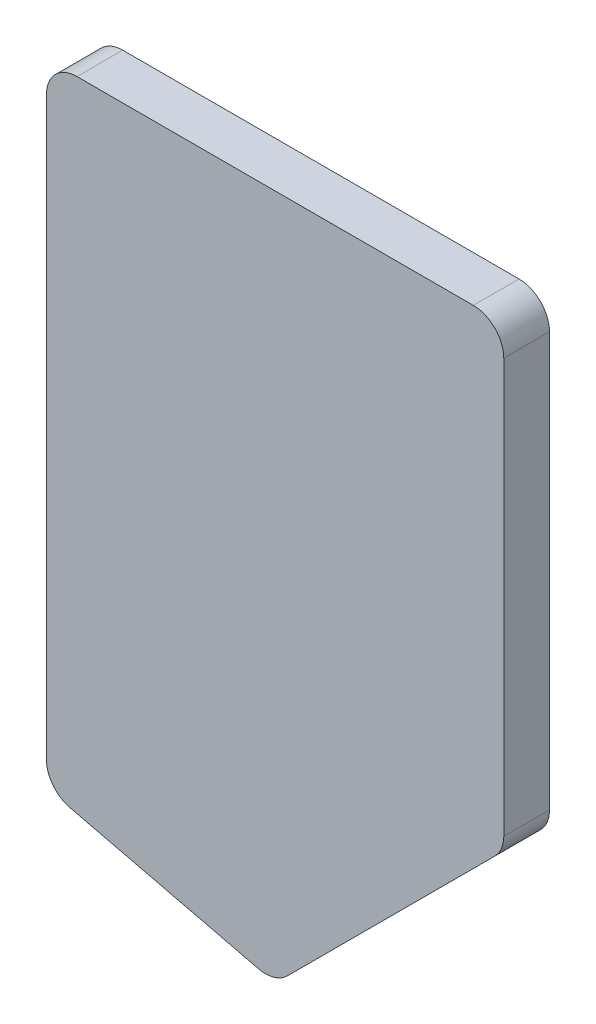
ISO-10303-21;
HEADER;
FILE_DESCRIPTION(('STEP AP214'),'2;1');
FILE_NAME('part.step','',(''),(''),'','','');
FILE_SCHEMA(('AUTOMOTIVE_DESIGN { 1 0 10303 214 1 1 1 1 }'));
ENDSEC;
DATA;
#1=APPLICATION_CONTEXT('core data for automotive mechanical design processes');
#2=APPLICATION_PROTOCOL_DEFINITION('international standard','automotive_design',2000,#1);
#3=PRODUCT_CONTEXT('',#1,'mechanical');
#4=PRODUCT('Part','Part','',(#3));
#5=PRODUCT_RELATED_PRODUCT_CATEGORY('part','',(#4));
#6=PRODUCT_DEFINITION_FORMATION('','',#4);
#7=PRODUCT_DEFINITION_CONTEXT('part definition',#1,'design');
#8=PRODUCT_DEFINITION('design','',#6,#7);
#9=PRODUCT_DEFINITION_SHAPE('','',#8);
#10=(LENGTH_UNIT() NAMED_UNIT(*) SI_UNIT(.MILLI.,.METRE.));
#11=(NAMED_UNIT(*) PLANE_ANGLE_UNIT() SI_UNIT($,.RADIAN.));
#12=(NAMED_UNIT(*) SI_UNIT($,.STERADIAN.) SOLID_ANGLE_UNIT());
#13=UNCERTAINTY_MEASURE_WITH_UNIT(LENGTH_MEASURE(1.E-05),#10,'distance_accuracy_value','');
#14=(GEOMETRIC_REPRESENTATION_CONTEXT(3) GLOBAL_UNCERTAINTY_ASSIGNED_CONTEXT((#13)) GLOBAL_UNIT_ASSIGNED_CONTEXT((#10,
#11,#12)) REPRESENTATION_CONTEXT('',''));
#15=CARTESIAN_POINT('',(0.,0.,0.));
#16=DIRECTION('',(0.,0.,1.));
#17=DIRECTION('',(1.,0.,0.));
#18=AXIS2_PLACEMENT_3D('',#15,#16,#17);
#19=CARTESIAN_POINT('',(140.,-42.3578643762691,15.));
#20=DIRECTION('',(0.,0.,1.));
#21=DIRECTION('',(1.,0.,0.));
#22=AXIS2_PLACEMENT_3D('',#19,#20,#21);
#23=CYLINDRICAL_SURFACE('',#22,10.);
#24=DIRECTION('',(0.,0.,1.));
#25=VECTOR('',#24,1.);
#26=CARTESIAN_POINT('',(147.071067811866,-49.4289321881345,15.));
#27=LINE('',#26,#25);
#28=CARTESIAN_POINT('',(147.071067811866,-49.4289321881345,0.));
#29=VERTEX_POINT('',#28);
#30=CARTESIAN_POINT('',(147.071067811866,-49.4289321881345,15.));
#31=VERTEX_POINT('',#30);
#32=EDGE_CURVE('E330',#29,#31,#27,.T.);
#33=ORIENTED_EDGE('',*,*,#32,.F.);
#34=CARTESIAN_POINT('',(140.,-42.3578643762691,0.));
#35=DIRECTION('',(0.,0.,1.));
#36=DIRECTION('',(1.,0.,0.));
#37=AXIS2_PLACEMENT_3D('',#34,#35,#36);
#38=CIRCLE('',#37,10.);
#39=CARTESIAN_POINT('',(150.,-42.3578643762691,0.));
#40=VERTEX_POINT('',#39);
#41=EDGE_CURVE('E336',#40,#29,#38,.F.);
#42=ORIENTED_EDGE('',*,*,#41,.F.);
#43=DIRECTION('',(0.,0.,1.));
#44=VECTOR('',#43,1.);
#45=CARTESIAN_POINT('',(150.,-42.3578643762691,15.));
#46=LINE('',#45,#44);
#47=CARTESIAN_POINT('',(150.,-42.3578643762691,15.));
#48=VERTEX_POINT('',#47);
#49=EDGE_CURVE('E333',#48,#40,#46,.F.);
#50=ORIENTED_EDGE('',*,*,#49,.F.);
#51=CARTESIAN_POINT('',(140.,-42.3578643762691,15.));
#52=DIRECTION('',(0.,0.,1.));
#53=DIRECTION('',(1.,0.,0.));
#54=AXIS2_PLACEMENT_3D('',#51,#52,#53);
#55=CIRCLE('',#54,10.);
#56=EDGE_CURVE('E338',#31,#48,#55,.T.);
#57=ORIENTED_EDGE('',*,*,#56,.F.);
#58=EDGE_LOOP('',(#33,#42,#50,#57));
#59=FACE_BOUND('',#58,.T.);
#60=ADVANCED_FACE('F32',(#59),#23,.T.);
#61=CARTESIAN_POINT('',(71.8885745822702,-110.469289794,15.));
#62=DIRECTION('',(0.,0.,1.));
#63=DIRECTION('',(1.,0.,0.));
#64=AXIS2_PLACEMENT_3D('',#61,#62,#63);
#65=CYLINDRICAL_SURFACE('',#64,10.);
#66=DIRECTION('',(0.,0.,1.));
#67=VECTOR('',#66,1.);
#68=CARTESIAN_POINT('',(69.5548450575168,-120.193162813805,15.));
#69=LINE('',#68,#67);
#70=CARTESIAN_POINT('',(69.5548450575168,-120.193162813805,0.));
#71=VERTEX_POINT('',#70);
#72=CARTESIAN_POINT('',(69.5548450575168,-120.193162813805,15.));
#73=VERTEX_POINT('',#72);
#74=EDGE_CURVE('E320',#71,#73,#69,.T.);
#75=ORIENTED_EDGE('',*,*,#74,.F.);
#76=CARTESIAN_POINT('',(71.8885745822702,-110.469289794,0.));
#77=DIRECTION('',(0.,0.,1.));
#78=DIRECTION('',(1.,0.,0.));
#79=AXIS2_PLACEMENT_3D('',#76,#77,#78);
#80=CIRCLE('',#79,10.);
#81=CARTESIAN_POINT('',(78.9596423941357,-117.540357605865,0.));
#82=VERTEX_POINT('',#81);
#83=EDGE_CURVE('E326',#82,#71,#80,.F.);
#84=ORIENTED_EDGE('',*,*,#83,.F.);
#85=DIRECTION('',(0.,0.,1.));
#86=VECTOR('',#85,1.);
#87=CARTESIAN_POINT('',(78.9596423941357,-117.540357605865,15.));
#88=LINE('',#87,#86);
#89=CARTESIAN_POINT('',(78.9596423941357,-117.540357605865,15.));
#90=VERTEX_POINT('',#89);
#91=EDGE_CURVE('E323',#90,#82,#88,.F.);
#92=ORIENTED_EDGE('',*,*,#91,.F.);
#93=CARTESIAN_POINT('',(71.8885745822702,-110.469289794,15.));
#94=DIRECTION('',(0.,0.,1.));
#95=DIRECTION('',(1.,0.,0.));
#96=AXIS2_PLACEMENT_3D('',#93,#94,#95);
#97=CIRCLE('',#96,10.);
#98=EDGE_CURVE('E328',#73,#90,#97,.T.);
#99=ORIENTED_EDGE('',*,*,#98,.F.);
#100=EDGE_LOOP('',(#75,#84,#92,#99));
#101=FACE_BOUND('',#100,.T.);
#102=ADVANCED_FACE('F383',(#101),#65,.T.);
#103=CARTESIAN_POINT('',(10.,-95.6160318942542,15.));
#104=DIRECTION('',(0.,0.,1.));
#105=DIRECTION('',(1.,0.,0.));
#106=AXIS2_PLACEMENT_3D('',#103,#104,#105);
#107=CYLINDRICAL_SURFACE('',#106,10.);
#108=DIRECTION('',(0.,0.,1.));
#109=VECTOR('',#108,1.);
#110=CARTESIAN_POINT('',(0.,-95.6160318942542,15.));
#111=LINE('',#110,#109);
#112=CARTESIAN_POINT('',(0.,-95.6160318942541,0.));
#113=VERTEX_POINT('',#112);
#114=CARTESIAN_POINT('',(0.,-95.6160318942541,15.));
#115=VERTEX_POINT('',#114);
#116=EDGE_CURVE('E297',#113,#115,#111,.T.);
#117=ORIENTED_EDGE('',*,*,#116,.F.);
#118=CARTESIAN_POINT('',(10.,-95.6160318942542,0.));
#119=DIRECTION('',(0.,0.,1.));
#120=DIRECTION('',(1.,0.,0.));
#121=AXIS2_PLACEMENT_3D('',#118,#119,#120);
#122=CIRCLE('',#121,10.);
#123=CARTESIAN_POINT('',(7.66627047524661,-105.339904914059,0.));
#124=VERTEX_POINT('',#123);
#125=EDGE_CURVE('E315',#124,#113,#122,.F.);
#126=ORIENTED_EDGE('',*,*,#125,.F.);
#127=DIRECTION('',(0.,0.,1.));
#128=VECTOR('',#127,1.);
#129=CARTESIAN_POINT('',(7.66627047524659,-105.339904914059,15.));
#130=LINE('',#129,#128);
#131=CARTESIAN_POINT('',(7.66627047524661,-105.339904914059,15.));
#132=VERTEX_POINT('',#131);
#133=EDGE_CURVE('E312',#132,#124,#130,.F.);
#134=ORIENTED_EDGE('',*,*,#133,.F.);
#135=CARTESIAN_POINT('',(10.,-95.6160318942542,15.));
#136=DIRECTION('',(0.,0.,1.));
#137=DIRECTION('',(1.,0.,0.));
#138=AXIS2_PLACEMENT_3D('',#135,#136,#137);
#139=CIRCLE('',#138,10.);
#140=EDGE_CURVE('E318',#115,#132,#139,.T.);
#141=ORIENTED_EDGE('',*,*,#140,.F.);
#142=EDGE_LOOP('',(#117,#126,#134,#141));
#143=FACE_BOUND('',#142,.T.);
#144=ADVANCED_FACE('F376',(#143),#107,.T.);
#145=CARTESIAN_POINT('',(75.,-121.500000000001,15.));
#146=DIRECTION('',(0.23337295247534,0.972387301980514,0.));
#147=DIRECTION('',(-0.972387301980514,0.23337295247534,0.));
#148=AXIS2_PLACEMENT_3D('',#145,#146,#147);
#149=PLANE('',#148);
#150=DIRECTION('',(0.972387301980514,-0.23337295247534,0.));
#151=VECTOR('',#150,1.);
#152=CARTESIAN_POINT('',(75.,-121.500000000001,0.));
#153=LINE('',#152,#151);
#154=EDGE_CURVE('E260',#124,#71,#153,.T.);
#155=ORIENTED_EDGE('',*,*,#154,.T.);
#156=ORIENTED_EDGE('',*,*,#74,.T.);
#157=DIRECTION('',(0.972387301980514,-0.23337295247534,0.));
#158=VECTOR('',#157,1.);
#159=CARTESIAN_POINT('',(75.,-121.500000000001,15.));
#160=LINE('',#159,#158);
#161=EDGE_CURVE('E282',#132,#73,#160,.T.);
#162=ORIENTED_EDGE('',*,*,#161,.F.);
#163=ORIENTED_EDGE('',*,*,#133,.T.);
#164=EDGE_LOOP('',(#155,#156,#162,#163));
#165=FACE_BOUND('',#164,.T.);
#166=ADVANCED_FACE('F380',(#165),#149,.F.);
#167=CARTESIAN_POINT('',(150.,-46.5,15.));
#168=DIRECTION('',(-0.707106781186554,0.707106781186541,0.));
#169=DIRECTION('',(-0.707106781186541,-0.707106781186554,0.));
#170=AXIS2_PLACEMENT_3D('',#167,#168,#169);
#171=PLANE('',#170);
#172=DIRECTION('',(0.707106781186541,0.707106781186554,0.));
#173=VECTOR('',#172,1.);
#174=CARTESIAN_POINT('',(150.,-46.5,0.));
#175=LINE('',#174,#173);
#176=EDGE_CURVE('E300',#82,#29,#175,.T.);
#177=ORIENTED_EDGE('',*,*,#176,.T.);
#178=ORIENTED_EDGE('',*,*,#32,.T.);
#179=DIRECTION('',(0.707106781186541,0.707106781186554,0.));
#180=VECTOR('',#179,1.);
#181=CARTESIAN_POINT('',(150.,-46.5,15.));
#182=LINE('',#181,#180);
#183=EDGE_CURVE('E285',#90,#31,#182,.T.);
#184=ORIENTED_EDGE('',*,*,#183,.F.);
#185=ORIENTED_EDGE('',*,*,#91,.T.);
#186=EDGE_LOOP('',(#177,#178,#184,#185));
#187=FACE_BOUND('',#186,.T.);
#188=ADVANCED_FACE('F387',(#187),#171,.F.);
#189=CARTESIAN_POINT('',(150.,103.5,15.));
#190=DIRECTION('',(-1.,0.,0.));
#191=DIRECTION('',(0.,0.,1.));
#192=AXIS2_PLACEMENT_3D('',#189,#190,#191);
#193=PLANE('',#192);
#194=DIRECTION('',(0.,1.,0.));
#195=VECTOR('',#194,1.);
#196=CARTESIAN_POINT('',(150.,103.5,0.));
#197=LINE('',#196,#195);
#198=CARTESIAN_POINT('',(150.,93.5,0.));
#199=VERTEX_POINT('',#198);
#200=EDGE_CURVE('E303',#40,#199,#197,.T.);
#201=ORIENTED_EDGE('',*,*,#200,.T.);
#202=DIRECTION('',(0.,0.,-1.));
#203=VECTOR('',#202,1.);
#204=CARTESIAN_POINT('',(150.,93.5,15.));
#205=LINE('',#204,#203);
#206=CARTESIAN_POINT('',(150.,93.5,15.));
#207=VERTEX_POINT('',#206);
#208=EDGE_CURVE('E345',#199,#207,#205,.F.);
#209=ORIENTED_EDGE('',*,*,#208,.T.);
#210=DIRECTION('',(0.,1.,0.));
#211=VECTOR('',#210,1.);
#212=CARTESIAN_POINT('',(150.,103.5,15.));
#213=LINE('',#212,#211);
#214=EDGE_CURVE('E289',#48,#207,#213,.T.);
#215=ORIENTED_EDGE('',*,*,#214,.F.);
#216=ORIENTED_EDGE('',*,*,#49,.T.);
#217=EDGE_LOOP('',(#201,#209,#215,#216));
#218=FACE_BOUND('',#217,.T.);
#219=ADVANCED_FACE('F394',(#218),#193,.F.);
#220=CARTESIAN_POINT('',(0.,103.5,15.));
#221=DIRECTION('',(0.,-1.,0.));
#222=DIRECTION('',(0.,0.,-1.));
#223=AXIS2_PLACEMENT_3D('',#220,#221,#222);
#224=PLANE('',#223);
#225=DIRECTION('',(-1.,0.,0.));
#226=VECTOR('',#225,1.);
#227=CARTESIAN_POINT('',(0.,103.5,0.));
#228=LINE('',#227,#226);
#229=CARTESIAN_POINT('',(140.,103.5,0.));
#230=VERTEX_POINT('',#229);
#231=CARTESIAN_POINT('',(10.,103.5,0.));
#232=VERTEX_POINT('',#231);
#233=EDGE_CURVE('E306',#230,#232,#228,.T.);
#234=ORIENTED_EDGE('',*,*,#233,.T.);
#235=DIRECTION('',(0.,0.,-1.));
#236=VECTOR('',#235,1.);
#237=CARTESIAN_POINT('',(10.,103.5,15.));
#238=LINE('',#237,#236);
#239=CARTESIAN_POINT('',(10.,103.5,15.));
#240=VERTEX_POINT('',#239);
#241=EDGE_CURVE('E40',#232,#240,#238,.F.);
#242=ORIENTED_EDGE('',*,*,#241,.T.);
#243=DIRECTION('',(-1.,0.,0.));
#244=VECTOR('',#243,1.);
#245=CARTESIAN_POINT('',(0.,103.5,15.));
#246=LINE('',#245,#244);
#247=CARTESIAN_POINT('',(140.,103.5,15.));
#248=VERTEX_POINT('',#247);
#249=EDGE_CURVE('E292',#248,#240,#246,.T.);
#250=ORIENTED_EDGE('',*,*,#249,.F.);
#251=DIRECTION('',(0.,0.,-1.));
#252=VECTOR('',#251,1.);
#253=CARTESIAN_POINT('',(140.,103.5,15.));
#254=LINE('',#253,#252);
#255=EDGE_CURVE('E340',#248,#230,#254,.T.);
#256=ORIENTED_EDGE('',*,*,#255,.T.);
#257=EDGE_LOOP('',(#234,#242,#250,#256));
#258=FACE_BOUND('',#257,.T.);
#259=ADVANCED_FACE('F356',(#258),#224,.F.);
#260=CARTESIAN_POINT('',(0.,103.5,15.));
#261=DIRECTION('',(1.,0.,0.));
#262=DIRECTION('',(0.,0.,-1.));
#263=AXIS2_PLACEMENT_3D('',#260,#261,#262);
#264=PLANE('',#263);
#265=DIRECTION('',(0.,-1.,0.));
#266=VECTOR('',#265,1.);
#267=CARTESIAN_POINT('',(0.,103.5,15.));
#268=LINE('',#267,#266);
#269=CARTESIAN_POINT('',(0.,93.5,15.));
#270=VERTEX_POINT('',#269);
#271=EDGE_CURVE('E295',#270,#115,#268,.T.);
#272=ORIENTED_EDGE('',*,*,#271,.F.);
#273=DIRECTION('',(0.,0.,-1.));
#274=VECTOR('',#273,1.);
#275=CARTESIAN_POINT('',(0.,93.5,15.));
#276=LINE('',#275,#274);
#277=CARTESIAN_POINT('',(0.,93.5,0.));
#278=VERTEX_POINT('',#277);
#279=EDGE_CURVE('E349',#270,#278,#276,.T.);
#280=ORIENTED_EDGE('',*,*,#279,.T.);
#281=DIRECTION('',(0.,-1.,0.));
#282=VECTOR('',#281,1.);
#283=CARTESIAN_POINT('',(0.,103.5,0.));
#284=LINE('',#283,#282);
#285=EDGE_CURVE('E286',#278,#113,#284,.T.);
#286=ORIENTED_EDGE('',*,*,#285,.T.);
#287=ORIENTED_EDGE('',*,*,#116,.T.);
#288=EDGE_LOOP('',(#272,#280,#286,#287));
#289=FACE_BOUND('',#288,.T.);
#290=ADVANCED_FACE('F368',(#289),#264,.F.);
#291=CARTESIAN_POINT('',(0.,0.,15.));
#292=DIRECTION('',(0.,0.,1.));
#293=DIRECTION('',(1.,0.,0.));
#294=AXIS2_PLACEMENT_3D('',#291,#292,#293);
#295=PLANE('',#294);
#296=ORIENTED_EDGE('',*,*,#249,.T.);
#297=CARTESIAN_POINT('',(10.,93.5,15.));
#298=DIRECTION('',(0.,0.,1.));
#299=DIRECTION('',(1.,0.,0.));
#300=AXIS2_PLACEMENT_3D('',#297,#298,#299);
#301=CIRCLE('',#300,10.);
#302=EDGE_CURVE('E11',#240,#270,#301,.T.);
#303=ORIENTED_EDGE('',*,*,#302,.T.);
#304=ORIENTED_EDGE('',*,*,#271,.T.);
#305=ORIENTED_EDGE('',*,*,#140,.T.);
#306=ORIENTED_EDGE('',*,*,#161,.T.);
#307=ORIENTED_EDGE('',*,*,#98,.T.);
#308=ORIENTED_EDGE('',*,*,#183,.T.);
#309=ORIENTED_EDGE('',*,*,#56,.T.);
#310=ORIENTED_EDGE('',*,*,#214,.T.);
#311=CARTESIAN_POINT('',(140.,93.5,15.));
#312=DIRECTION('',(0.,0.,1.));
#313=DIRECTION('',(1.,0.,0.));
#314=AXIS2_PLACEMENT_3D('',#311,#312,#313);
#315=CIRCLE('',#314,10.);
#316=EDGE_CURVE('E347',#207,#248,#315,.T.);
#317=ORIENTED_EDGE('',*,*,#316,.T.);
#318=EDGE_LOOP('',(#296,#303,#304,#305,#306,#307,#308,#309,#310,#317));
#319=FACE_BOUND('',#318,.T.);
#320=ADVANCED_FACE('F362',(#319),#295,.T.);
#321=CARTESIAN_POINT('',(0.,0.,0.));
#322=DIRECTION('',(0.,0.,1.));
#323=DIRECTION('',(1.,0.,0.));
#324=AXIS2_PLACEMENT_3D('',#321,#322,#323);
#325=PLANE('',#324);
#326=DIRECTION('',(0.,1.,0.));
#327=VECTOR('',#326,1.);
#328=CARTESIAN_POINT('',(12.2354893582894,0.,0.));
#329=LINE('',#328,#327);
#330=CARTESIAN_POINT('',(12.2354893582894,0.,0.));
#331=VERTEX_POINT('',#330);
#332=CARTESIAN_POINT('',(12.2354893582894,3.56242925771255,0.));
#333=VERTEX_POINT('',#332);
#334=EDGE_CURVE('E250',#331,#333,#329,.T.);
#335=ORIENTED_EDGE('',*,*,#334,.F.);
#336=DIRECTION('',(-1.,0.,0.));
#337=VECTOR('',#336,1.);
#338=CARTESIAN_POINT('',(0.,0.,0.));
#339=LINE('',#338,#337);
#340=CARTESIAN_POINT('',(87.7831553618904,0.,0.));
#341=VERTEX_POINT('',#340);
#342=EDGE_CURVE('E248',#341,#331,#339,.T.);
#343=ORIENTED_EDGE('',*,*,#342,.F.);
#344=DIRECTION('',(0.,1.,0.));
#345=VECTOR('',#344,1.);
#346=CARTESIAN_POINT('',(87.7831553618904,0.,0.));
#347=LINE('',#346,#345);
#348=CARTESIAN_POINT('',(87.7831553618904,94.4213382511947,0.));
#349=VERTEX_POINT('',#348);
#350=EDGE_CURVE('E203',#341,#349,#347,.T.);
#351=ORIENTED_EDGE('',*,*,#350,.T.);
#352=DIRECTION('',(-1.,0.,0.));
#353=VECTOR('',#352,1.);
#354=CARTESIAN_POINT('',(0.,94.4213382511947,0.));
#355=LINE('',#354,#353);
#356=CARTESIAN_POINT('',(83.5815560775899,94.4213382511947,0.));
#357=VERTEX_POINT('',#356);
#358=EDGE_CURVE('E206',#349,#357,#355,.T.);
#359=ORIENTED_EDGE('',*,*,#358,.T.);
#360=DIRECTION('',(0.617590976132357,0.786499450857966,0.));
#361=VECTOR('',#360,1.);
#362=CARTESIAN_POINT('',(5.83824952232281,-4.5844281486304,0.));
#363=LINE('',#362,#361);
#364=EDGE_CURVE('E253',#333,#357,#363,.T.);
#365=ORIENTED_EDGE('',*,*,#364,.F.);
#366=EDGE_LOOP('',(#335,#343,#351,#359,#365));
#367=FACE_BOUND('',#366,.T.);
#368=ORIENTED_EDGE('',*,*,#285,.F.);
#369=CARTESIAN_POINT('',(10.,93.5,0.));
#370=DIRECTION('',(0.,0.,1.));
#371=DIRECTION('',(1.,0.,0.));
#372=AXIS2_PLACEMENT_3D('',#369,#370,#371);
#373=CIRCLE('',#372,10.);
#374=EDGE_CURVE('E352',#278,#232,#373,.F.);
#375=ORIENTED_EDGE('',*,*,#374,.T.);
#376=ORIENTED_EDGE('',*,*,#233,.F.);
#377=CARTESIAN_POINT('',(140.,93.5,0.));
#378=DIRECTION('',(0.,0.,1.));
#379=DIRECTION('',(1.,0.,0.));
#380=AXIS2_PLACEMENT_3D('',#377,#378,#379);
#381=CIRCLE('',#380,10.);
#382=EDGE_CURVE('E343',#230,#199,#381,.F.);
#383=ORIENTED_EDGE('',*,*,#382,.T.);
#384=ORIENTED_EDGE('',*,*,#200,.F.);
#385=ORIENTED_EDGE('',*,*,#41,.T.);
#386=ORIENTED_EDGE('',*,*,#176,.F.);
#387=ORIENTED_EDGE('',*,*,#83,.T.);
#388=ORIENTED_EDGE('',*,*,#154,.F.);
#389=ORIENTED_EDGE('',*,*,#125,.T.);
#390=EDGE_LOOP('',(#368,#375,#376,#383,#384,#385,#386,#387,#388,#389));
#391=FACE_BOUND('',#390,.T.);
#392=ADVANCED_FACE('F370',(#367,#391),#325,.F.);
#393=CARTESIAN_POINT('',(140.,93.5,15.));
#394=DIRECTION('',(0.,0.,-1.));
#395=DIRECTION('',(-1.,0.,0.));
#396=AXIS2_PLACEMENT_3D('',#393,#394,#395);
#397=CYLINDRICAL_SURFACE('',#396,10.);
#398=ORIENTED_EDGE('',*,*,#316,.F.);
#399=ORIENTED_EDGE('',*,*,#208,.F.);
#400=ORIENTED_EDGE('',*,*,#382,.F.);
#401=ORIENTED_EDGE('',*,*,#255,.F.);
#402=EDGE_LOOP('',(#398,#399,#400,#401));
#403=FACE_BOUND('',#402,.T.);
#404=ADVANCED_FACE('F397',(#403),#397,.T.);
#405=CARTESIAN_POINT('',(10.,93.5,15.));
#406=DIRECTION('',(0.,0.,-1.));
#407=DIRECTION('',(-1.,0.,0.));
#408=AXIS2_PLACEMENT_3D('',#405,#406,#407);
#409=CYLINDRICAL_SURFACE('',#408,10.);
#410=ORIENTED_EDGE('',*,*,#302,.F.);
#411=ORIENTED_EDGE('',*,*,#241,.F.);
#412=ORIENTED_EDGE('',*,*,#374,.F.);
#413=ORIENTED_EDGE('',*,*,#279,.F.);
#414=EDGE_LOOP('',(#410,#411,#412,#413));
#415=FACE_BOUND('',#414,.T.);
#416=ADVANCED_FACE('F34',(#415),#409,.T.);
#417=CARTESIAN_POINT('',(0.,0.,2.));
#418=DIRECTION('',(0.,-1.,0.));
#419=DIRECTION('',(0.,0.,-1.));
#420=AXIS2_PLACEMENT_3D('',#417,#418,#419);
#421=PLANE('',#420);
#422=ORIENTED_EDGE('',*,*,#342,.T.);
#423=DIRECTION('',(0.,0.,-1.));
#424=VECTOR('',#423,1.);
#425=CARTESIAN_POINT('',(12.2354893582894,0.,2.));
#426=LINE('',#425,#424);
#427=CARTESIAN_POINT('',(12.2354893582894,0.,2.));
#428=VERTEX_POINT('',#427);
#429=EDGE_CURVE('E268',#428,#331,#426,.T.);
#430=ORIENTED_EDGE('',*,*,#429,.F.);
#431=DIRECTION('',(-1.,0.,0.));
#432=VECTOR('',#431,1.);
#433=CARTESIAN_POINT('',(0.,0.,2.));
#434=LINE('',#433,#432);
#435=CARTESIAN_POINT('',(87.7831553618904,0.,2.));
#436=VERTEX_POINT('',#435);
#437=EDGE_CURVE('E219',#436,#428,#434,.T.);
#438=ORIENTED_EDGE('',*,*,#437,.F.);
#439=DIRECTION('',(0.,0.,-1.));
#440=VECTOR('',#439,1.);
#441=CARTESIAN_POINT('',(87.7831553618904,0.,2.));
#442=LINE('',#441,#440);
#443=EDGE_CURVE('E258',#436,#341,#442,.T.);
#444=ORIENTED_EDGE('',*,*,#443,.T.);
#445=EDGE_LOOP('',(#422,#430,#438,#444));
#446=FACE_BOUND('',#445,.T.);
#447=ADVANCED_FACE('F403',(#446),#421,.F.);
#448=CARTESIAN_POINT('',(87.7831553618904,0.,2.));
#449=DIRECTION('',(-1.,0.,0.));
#450=DIRECTION('',(0.,0.,1.));
#451=AXIS2_PLACEMENT_3D('',#448,#449,#450);
#452=PLANE('',#451);
#453=ORIENTED_EDGE('',*,*,#350,.F.);
#454=ORIENTED_EDGE('',*,*,#443,.F.);
#455=DIRECTION('',(0.,1.,0.));
#456=VECTOR('',#455,1.);
#457=CARTESIAN_POINT('',(87.7831553618904,0.,2.));
#458=LINE('',#457,#456);
#459=CARTESIAN_POINT('',(87.7831553618904,94.4213382511947,2.));
#460=VERTEX_POINT('',#459);
#461=EDGE_CURVE('E196',#436,#460,#458,.T.);
#462=ORIENTED_EDGE('',*,*,#461,.T.);
#463=DIRECTION('',(0.,0.,-1.));
#464=VECTOR('',#463,1.);
#465=CARTESIAN_POINT('',(87.7831553618904,94.4213382511947,2.));
#466=LINE('',#465,#464);
#467=EDGE_CURVE('E261',#460,#349,#466,.T.);
#468=ORIENTED_EDGE('',*,*,#467,.T.);
#469=EDGE_LOOP('',(#453,#454,#462,#468));
#470=FACE_BOUND('',#469,.T.);
#471=ADVANCED_FACE('F456',(#470),#452,.T.);
#472=CARTESIAN_POINT('',(0.,94.4213382511947,2.));
#473=DIRECTION('',(0.,-1.,0.));
#474=DIRECTION('',(0.,0.,-1.));
#475=AXIS2_PLACEMENT_3D('',#472,#473,#474);
#476=PLANE('',#475);
#477=ORIENTED_EDGE('',*,*,#358,.F.);
#478=ORIENTED_EDGE('',*,*,#467,.F.);
#479=DIRECTION('',(-1.,0.,0.));
#480=VECTOR('',#479,1.);
#481=CARTESIAN_POINT('',(0.,94.4213382511947,2.));
#482=LINE('',#481,#480);
#483=CARTESIAN_POINT('',(83.5815560775899,94.4213382511947,2.));
#484=VERTEX_POINT('',#483);
#485=EDGE_CURVE('E228',#460,#484,#482,.T.);
#486=ORIENTED_EDGE('',*,*,#485,.T.);
#487=DIRECTION('',(0.,0.,-1.));
#488=VECTOR('',#487,1.);
#489=CARTESIAN_POINT('',(83.5815560775899,94.4213382511947,2.));
#490=LINE('',#489,#488);
#491=EDGE_CURVE('E264',#484,#357,#490,.T.);
#492=ORIENTED_EDGE('',*,*,#491,.T.);
#493=EDGE_LOOP('',(#477,#478,#486,#492));
#494=FACE_BOUND('',#493,.T.);
#495=ADVANCED_FACE('F463',(#494),#476,.T.);
#496=CARTESIAN_POINT('',(5.83824952232281,-4.5844281486304,2.));
#497=DIRECTION('',(-0.786499450857966,0.617590976132357,0.));
#498=DIRECTION('',(-0.617590976132357,-0.786499450857966,0.));
#499=AXIS2_PLACEMENT_3D('',#496,#497,#498);
#500=PLANE('',#499);
#501=ORIENTED_EDGE('',*,*,#364,.T.);
#502=ORIENTED_EDGE('',*,*,#491,.F.);
#503=DIRECTION('',(0.617590976132357,0.786499450857966,0.));
#504=VECTOR('',#503,1.);
#505=CARTESIAN_POINT('',(5.83824952232281,-4.5844281486304,2.));
#506=LINE('',#505,#504);
#507=CARTESIAN_POINT('',(12.2354893582894,3.56242925771255,2.));
#508=VERTEX_POINT('',#507);
#509=EDGE_CURVE('E225',#508,#484,#506,.T.);
#510=ORIENTED_EDGE('',*,*,#509,.F.);
#511=DIRECTION('',(0.,0.,-1.));
#512=VECTOR('',#511,1.);
#513=CARTESIAN_POINT('',(12.2354893582894,3.56242925771255,2.));
#514=LINE('',#513,#512);
#515=EDGE_CURVE('E266',#508,#333,#514,.T.);
#516=ORIENTED_EDGE('',*,*,#515,.T.);
#517=EDGE_LOOP('',(#501,#502,#510,#516));
#518=FACE_BOUND('',#517,.T.);
#519=ADVANCED_FACE('F447',(#518),#500,.F.);
#520=CARTESIAN_POINT('',(0.,3.56242925771255,2.));
#521=DIRECTION('',(0.,-1.,0.));
#522=DIRECTION('',(1.,0.,0.));
#523=AXIS2_PLACEMENT_3D('',#520,#521,#522);
#524=PLANE('',#523);
#525=DIRECTION('',(-1.,0.,0.));
#526=VECTOR('',#525,1.);
#527=CARTESIAN_POINT('',(0.,3.56242925771255,0.));
#528=LINE('',#527,#526);
#529=CARTESIAN_POINT('',(42.6035633670807,3.56242925771255,0.));
#530=VERTEX_POINT('',#529);
#531=CARTESIAN_POINT('',(15.085832519145,3.56242925771255,0.));
#532=VERTEX_POINT('',#531);
#533=EDGE_CURVE('E47',#530,#532,#528,.T.);
#534=ORIENTED_EDGE('',*,*,#533,.F.);
#535=DIRECTION('',(0.,0.,-1.));
#536=VECTOR('',#535,1.);
#537=CARTESIAN_POINT('',(42.6035633670807,3.56242925771255,2.));
#538=LINE('',#537,#536);
#539=CARTESIAN_POINT('',(42.6035633670807,3.56242925771255,2.));
#540=VERTEX_POINT('',#539);
#541=EDGE_CURVE('E275',#540,#530,#538,.T.);
#542=ORIENTED_EDGE('',*,*,#541,.F.);
#543=DIRECTION('',(-1.,0.,0.));
#544=VECTOR('',#543,1.);
#545=CARTESIAN_POINT('',(0.,3.56242925771255,2.));
#546=LINE('',#545,#544);
#547=CARTESIAN_POINT('',(15.085832519145,3.56242925771255,2.));
#548=VERTEX_POINT('',#547);
#549=EDGE_CURVE('E211',#540,#548,#546,.T.);
#550=ORIENTED_EDGE('',*,*,#549,.T.);
#551=DIRECTION('',(0.,0.,-1.));
#552=VECTOR('',#551,1.);
#553=CARTESIAN_POINT('',(15.085832519145,3.56242925771255,2.));
#554=LINE('',#553,#552);
#555=EDGE_CURVE('E271',#548,#532,#554,.T.);
#556=ORIENTED_EDGE('',*,*,#555,.T.);
#557=EDGE_LOOP('',(#534,#542,#550,#556));
#558=FACE_BOUND('',#557,.T.);
#559=ADVANCED_FACE('F444',(#558),#524,.T.);
#560=CARTESIAN_POINT('',(7.45984750280314,-5.96871510209121,2.));
#561=DIRECTION('',(-0.780826066312519,0.624748472720756,0.));
#562=DIRECTION('',(-0.624748472720756,-0.780826066312519,0.));
#563=AXIS2_PLACEMENT_3D('',#560,#561,#562);
#564=PLANE('',#563);
#565=DIRECTION('',(0.624748472720756,0.780826066312519,0.));
#566=VECTOR('',#565,1.);
#567=CARTESIAN_POINT('',(7.45984750280314,-5.96871510209121,0.));
#568=LINE('',#567,#566);
#569=CARTESIAN_POINT('',(42.6035633670807,37.9547686871586,0.));
#570=VERTEX_POINT('',#569);
#571=EDGE_CURVE('E245',#532,#570,#568,.T.);
#572=ORIENTED_EDGE('',*,*,#571,.F.);
#573=ORIENTED_EDGE('',*,*,#555,.F.);
#574=DIRECTION('',(0.624748472720756,0.780826066312519,0.));
#575=VECTOR('',#574,1.);
#576=CARTESIAN_POINT('',(7.45984750280314,-5.96871510209121,2.));
#577=LINE('',#576,#575);
#578=CARTESIAN_POINT('',(42.6035633670807,37.9547686871586,2.));
#579=VERTEX_POINT('',#578);
#580=EDGE_CURVE('E217',#548,#579,#577,.T.);
#581=ORIENTED_EDGE('',*,*,#580,.T.);
#582=DIRECTION('',(0.,0.,-1.));
#583=VECTOR('',#582,1.);
#584=CARTESIAN_POINT('',(42.6035633670807,37.9547686871586,2.));
#585=LINE('',#584,#583);
#586=EDGE_CURVE('E273',#579,#570,#585,.T.);
#587=ORIENTED_EDGE('',*,*,#586,.T.);
#588=EDGE_LOOP('',(#572,#573,#581,#587));
#589=FACE_BOUND('',#588,.T.);
#590=ADVANCED_FACE('F432',(#589),#564,.T.);
#591=CARTESIAN_POINT('',(7.45984750280314,-5.96871510209121,2.));
#592=DIRECTION('',(-0.780826066312519,0.624748472720756,0.));
#593=DIRECTION('',(-0.624748472720756,-0.780826066312519,0.));
#594=AXIS2_PLACEMENT_3D('',#591,#592,#593);
#595=PLANE('',#594);
#596=DIRECTION('',(0.624748472720756,0.780826066312519,0.));
#597=VECTOR('',#596,1.);
#598=CARTESIAN_POINT('',(7.45984750280314,-5.96871510209121,0.));
#599=LINE('',#598,#597);
#600=CARTESIAN_POINT('',(46.5977155570241,42.9467587101916,0.));
#601=VERTEX_POINT('',#600);
#602=CARTESIAN_POINT('',(83.5815560775899,89.1700757277435,0.));
#603=VERTEX_POINT('',#602);
#604=EDGE_CURVE('E55',#601,#603,#599,.T.);
#605=ORIENTED_EDGE('',*,*,#604,.F.);
#606=DIRECTION('',(0.,0.,-1.));
#607=VECTOR('',#606,1.);
#608=CARTESIAN_POINT('',(46.5977155570241,42.9467587101916,2.));
#609=LINE('',#608,#607);
#610=CARTESIAN_POINT('',(46.5977155570241,42.9467587101916,2.));
#611=VERTEX_POINT('',#610);
#612=EDGE_CURVE('E185',#611,#601,#609,.T.);
#613=ORIENTED_EDGE('',*,*,#612,.F.);
#614=DIRECTION('',(0.624748472720756,0.780826066312519,0.));
#615=VECTOR('',#614,1.);
#616=CARTESIAN_POINT('',(7.45984750280314,-5.96871510209121,2.));
#617=LINE('',#616,#615);
#618=CARTESIAN_POINT('',(83.5815560775899,89.1700757277435,2.));
#619=VERTEX_POINT('',#618);
#620=EDGE_CURVE('E192',#611,#619,#617,.T.);
#621=ORIENTED_EDGE('',*,*,#620,.T.);
#622=DIRECTION('',(0.,0.,-1.));
#623=VECTOR('',#622,1.);
#624=CARTESIAN_POINT('',(83.5815560775899,89.1700757277435,2.));
#625=LINE('',#624,#623);
#626=EDGE_CURVE('E277',#619,#603,#625,.T.);
#627=ORIENTED_EDGE('',*,*,#626,.T.);
#628=EDGE_LOOP('',(#605,#613,#621,#627));
#629=FACE_BOUND('',#628,.T.);
#630=ADVANCED_FACE('F194',(#629),#595,.T.);
#631=CARTESIAN_POINT('',(83.5815560775899,0.,2.));
#632=DIRECTION('',(-1.,0.,0.));
#633=DIRECTION('',(0.,0.,1.));
#634=AXIS2_PLACEMENT_3D('',#631,#632,#633);
#635=PLANE('',#634);
#636=DIRECTION('',(0.,1.,0.));
#637=VECTOR('',#636,1.);
#638=CARTESIAN_POINT('',(83.5815560775899,0.,0.));
#639=LINE('',#638,#637);
#640=CARTESIAN_POINT('',(83.5815560775899,3.56242925771255,0.));
#641=VERTEX_POINT('',#640);
#642=EDGE_CURVE('E238',#641,#603,#639,.T.);
#643=ORIENTED_EDGE('',*,*,#642,.T.);
#644=ORIENTED_EDGE('',*,*,#626,.F.);
#645=DIRECTION('',(0.,1.,0.));
#646=VECTOR('',#645,1.);
#647=CARTESIAN_POINT('',(83.5815560775899,0.,2.));
#648=LINE('',#647,#646);
#649=CARTESIAN_POINT('',(83.5815560775899,3.56242925771255,2.));
#650=VERTEX_POINT('',#649);
#651=EDGE_CURVE('E202',#650,#619,#648,.T.);
#652=ORIENTED_EDGE('',*,*,#651,.F.);
#653=DIRECTION('',(0.,0.,-1.));
#654=VECTOR('',#653,1.);
#655=CARTESIAN_POINT('',(83.5815560775899,3.56242925771255,2.));
#656=LINE('',#655,#654);
#657=EDGE_CURVE('E279',#650,#641,#656,.T.);
#658=ORIENTED_EDGE('',*,*,#657,.T.);
#659=EDGE_LOOP('',(#643,#644,#652,#658));
#660=FACE_BOUND('',#659,.T.);
#661=ADVANCED_FACE('F431',(#660),#635,.F.);
#662=CARTESIAN_POINT('',(0.,3.56242925771255,2.));
#663=DIRECTION('',(0.,-1.,0.));
#664=DIRECTION('',(1.,0.,0.));
#665=AXIS2_PLACEMENT_3D('',#662,#663,#664);
#666=PLANE('',#665);
#667=DIRECTION('',(-1.,0.,0.));
#668=VECTOR('',#667,1.);
#669=CARTESIAN_POINT('',(0.,3.56242925771255,0.));
#670=LINE('',#669,#668);
#671=CARTESIAN_POINT('',(46.5977155570241,3.56242925771255,0.));
#672=VERTEX_POINT('',#671);
#673=EDGE_CURVE('E235',#641,#672,#670,.T.);
#674=ORIENTED_EDGE('',*,*,#673,.F.);
#675=ORIENTED_EDGE('',*,*,#657,.F.);
#676=DIRECTION('',(-1.,0.,0.));
#677=VECTOR('',#676,1.);
#678=CARTESIAN_POINT('',(0.,3.56242925771255,2.));
#679=LINE('',#678,#677);
#680=CARTESIAN_POINT('',(46.5977155570241,3.56242925771255,2.));
#681=VERTEX_POINT('',#680);
#682=EDGE_CURVE('E191',#650,#681,#679,.T.);
#683=ORIENTED_EDGE('',*,*,#682,.T.);
#684=DIRECTION('',(0.,0.,-1.));
#685=VECTOR('',#684,1.);
#686=CARTESIAN_POINT('',(46.5977155570241,3.56242925771255,2.));
#687=LINE('',#686,#685);
#688=EDGE_CURVE('E187',#681,#672,#687,.T.);
#689=ORIENTED_EDGE('',*,*,#688,.T.);
#690=EDGE_LOOP('',(#674,#675,#683,#689));
#691=FACE_BOUND('',#690,.T.);
#692=ADVANCED_FACE('F437',(#691),#666,.T.);
#693=CARTESIAN_POINT('',(42.6035633670807,0.,2.));
#694=DIRECTION('',(-1.,0.,0.));
#695=DIRECTION('',(0.,0.,1.));
#696=AXIS2_PLACEMENT_3D('',#693,#694,#695);
#697=PLANE('',#696);
#698=DIRECTION('',(0.,1.,0.));
#699=VECTOR('',#698,1.);
#700=CARTESIAN_POINT('',(42.6035633670807,0.,0.));
#701=LINE('',#700,#699);
#702=EDGE_CURVE('E242',#530,#570,#701,.T.);
#703=ORIENTED_EDGE('',*,*,#702,.T.);
#704=ORIENTED_EDGE('',*,*,#586,.F.);
#705=DIRECTION('',(0.,1.,0.));
#706=VECTOR('',#705,1.);
#707=CARTESIAN_POINT('',(42.6035633670807,0.,2.));
#708=LINE('',#707,#706);
#709=EDGE_CURVE('E214',#540,#579,#708,.T.);
#710=ORIENTED_EDGE('',*,*,#709,.F.);
#711=ORIENTED_EDGE('',*,*,#541,.T.);
#712=EDGE_LOOP('',(#703,#704,#710,#711));
#713=FACE_BOUND('',#712,.T.);
#714=ADVANCED_FACE('F436',(#713),#697,.F.);
#715=CARTESIAN_POINT('',(46.5977155570241,0.,2.));
#716=DIRECTION('',(-1.,0.,0.));
#717=DIRECTION('',(0.,0.,1.));
#718=AXIS2_PLACEMENT_3D('',#715,#716,#717);
#719=PLANE('',#718);
#720=DIRECTION('',(0.,1.,0.));
#721=VECTOR('',#720,1.);
#722=CARTESIAN_POINT('',(46.5977155570241,0.,0.));
#723=LINE('',#722,#721);
#724=EDGE_CURVE('E233',#672,#601,#723,.T.);
#725=ORIENTED_EDGE('',*,*,#724,.F.);
#726=ORIENTED_EDGE('',*,*,#688,.F.);
#727=DIRECTION('',(0.,1.,0.));
#728=VECTOR('',#727,1.);
#729=CARTESIAN_POINT('',(46.5977155570241,0.,2.));
#730=LINE('',#729,#728);
#731=EDGE_CURVE('E182',#681,#611,#730,.T.);
#732=ORIENTED_EDGE('',*,*,#731,.T.);
#733=ORIENTED_EDGE('',*,*,#612,.T.);
#734=EDGE_LOOP('',(#725,#726,#732,#733));
#735=FACE_BOUND('',#734,.T.);
#736=ADVANCED_FACE('F184',(#735),#719,.T.);
#737=CARTESIAN_POINT('',(12.2354893582894,0.,2.));
#738=DIRECTION('',(-1.,0.,0.));
#739=DIRECTION('',(0.,0.,1.));
#740=AXIS2_PLACEMENT_3D('',#737,#738,#739);
#741=PLANE('',#740);
#742=ORIENTED_EDGE('',*,*,#334,.T.);
#743=ORIENTED_EDGE('',*,*,#515,.F.);
#744=DIRECTION('',(0.,1.,0.));
#745=VECTOR('',#744,1.);
#746=CARTESIAN_POINT('',(12.2354893582894,0.,2.));
#747=LINE('',#746,#745);
#748=EDGE_CURVE('E222',#428,#508,#747,.T.);
#749=ORIENTED_EDGE('',*,*,#748,.F.);
#750=ORIENTED_EDGE('',*,*,#429,.T.);
#751=EDGE_LOOP('',(#742,#743,#749,#750));
#752=FACE_BOUND('',#751,.T.);
#753=ADVANCED_FACE('F435',(#752),#741,.F.);
#754=CARTESIAN_POINT('',(0.,0.,2.));
#755=DIRECTION('',(0.,0.,-1.));
#756=DIRECTION('',(-1.,0.,0.));
#757=AXIS2_PLACEMENT_3D('',#754,#755,#756);
#758=PLANE('',#757);
#759=ORIENTED_EDGE('',*,*,#620,.F.);
#760=ORIENTED_EDGE('',*,*,#731,.F.);
#761=ORIENTED_EDGE('',*,*,#682,.F.);
#762=ORIENTED_EDGE('',*,*,#651,.T.);
#763=EDGE_LOOP('',(#759,#760,#761,#762));
#764=FACE_BOUND('',#763,.T.);
#765=ORIENTED_EDGE('',*,*,#549,.F.);
#766=ORIENTED_EDGE('',*,*,#709,.T.);
#767=ORIENTED_EDGE('',*,*,#580,.F.);
#768=EDGE_LOOP('',(#765,#766,#767));
#769=FACE_BOUND('',#768,.T.);
#770=ORIENTED_EDGE('',*,*,#437,.T.);
#771=ORIENTED_EDGE('',*,*,#748,.T.);
#772=ORIENTED_EDGE('',*,*,#509,.T.);
#773=ORIENTED_EDGE('',*,*,#485,.F.);
#774=ORIENTED_EDGE('',*,*,#461,.F.);
#775=EDGE_LOOP('',(#770,#771,#772,#773,#774));
#776=FACE_BOUND('',#775,.T.);
#777=ADVANCED_FACE('F199',(#764,#769,#776),#758,.T.);
#778=ORIENTED_EDGE('',*,*,#604,.T.);
#779=ORIENTED_EDGE('',*,*,#642,.F.);
#780=ORIENTED_EDGE('',*,*,#673,.T.);
#781=ORIENTED_EDGE('',*,*,#724,.T.);
#782=EDGE_LOOP('',(#778,#779,#780,#781));
#783=FACE_BOUND('',#782,.T.);
#784=ADVANCED_FACE('F407',(#783),#325,.F.);
#785=ORIENTED_EDGE('',*,*,#533,.T.);
#786=ORIENTED_EDGE('',*,*,#571,.T.);
#787=ORIENTED_EDGE('',*,*,#702,.F.);
#788=EDGE_LOOP('',(#785,#786,#787));
#789=FACE_BOUND('',#788,.T.);
#790=ADVANCED_FACE('F406',(#789),#325,.F.);
#791=CLOSED_SHELL('',(#60,#102,#144,#166,#188,#219,#259,#290,#320,#392,#404,#416,#447,#471,#495,
#519,#559,#590,#630,#661,#692,#714,#736,#753,#777,#784,#790));
#792=MANIFOLD_SOLID_BREP('B2',#791);
#793=ADVANCED_BREP_SHAPE_REPRESENTATION('',(#18,#792),#14);
#794=SHAPE_DEFINITION_REPRESENTATION(#9,#793);
ENDSEC;
END-ISO-10303-21;
